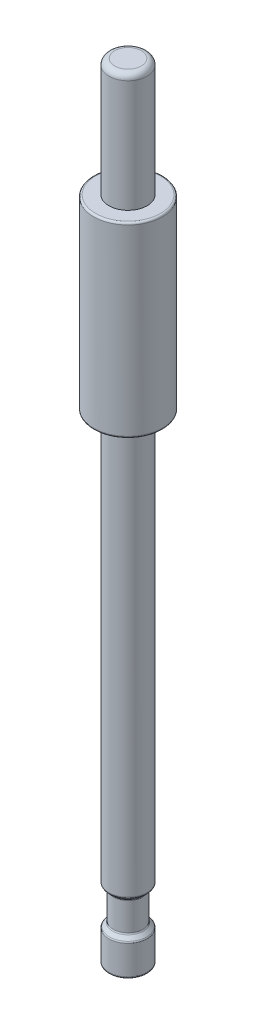
ISO-10303-21;
HEADER;
FILE_DESCRIPTION(('STEP AP214'),'2;1');
FILE_NAME('part.step','',(''),(''),'','','');
FILE_SCHEMA(('AUTOMOTIVE_DESIGN { 1 0 10303 214 1 1 1 1 }'));
ENDSEC;
DATA;
#1=APPLICATION_CONTEXT('core data for automotive mechanical design processes');
#2=APPLICATION_PROTOCOL_DEFINITION('international standard','automotive_design',2000,#1);
#3=PRODUCT_CONTEXT('',#1,'mechanical');
#4=PRODUCT('Part','Part','',(#3));
#5=PRODUCT_RELATED_PRODUCT_CATEGORY('part','',(#4));
#6=PRODUCT_DEFINITION_FORMATION('','',#4);
#7=PRODUCT_DEFINITION_CONTEXT('part definition',#1,'design');
#8=PRODUCT_DEFINITION('design','',#6,#7);
#9=PRODUCT_DEFINITION_SHAPE('','',#8);
#10=(LENGTH_UNIT() NAMED_UNIT(*) SI_UNIT(.MILLI.,.METRE.));
#11=(NAMED_UNIT(*) PLANE_ANGLE_UNIT() SI_UNIT($,.RADIAN.));
#12=(NAMED_UNIT(*) SI_UNIT($,.STERADIAN.) SOLID_ANGLE_UNIT());
#13=UNCERTAINTY_MEASURE_WITH_UNIT(LENGTH_MEASURE(1.E-05),#10,'distance_accuracy_value','');
#14=(GEOMETRIC_REPRESENTATION_CONTEXT(3) GLOBAL_UNCERTAINTY_ASSIGNED_CONTEXT((#13)) GLOBAL_UNIT_ASSIGNED_CONTEXT((#10,
#11,#12)) REPRESENTATION_CONTEXT('',''));
#15=CARTESIAN_POINT('',(0.,0.,0.));
#16=DIRECTION('',(0.,0.,1.));
#17=DIRECTION('',(1.,0.,0.));
#18=AXIS2_PLACEMENT_3D('',#15,#16,#17);
#19=CARTESIAN_POINT('',(0.,0.,0.));
#20=DIRECTION('',(0.,-1.,0.));
#21=DIRECTION('',(0.,0.,-1.));
#22=AXIS2_PLACEMENT_3D('',#19,#20,#21);
#23=PLANE('',#22);
#24=CARTESIAN_POINT('',(0.,0.,0.));
#25=DIRECTION('',(0.,-1.,0.));
#26=DIRECTION('',(0.,0.,-1.));
#27=AXIS2_PLACEMENT_3D('',#24,#25,#26);
#28=CIRCLE('',#27,0.675000000000002);
#29=CARTESIAN_POINT('',(0.,0.,-0.675000000000004));
#30=VERTEX_POINT('',#29);
#31=EDGE_CURVE('E11',#30,#30,#28,.F.);
#32=ORIENTED_EDGE('',*,*,#31,.T.);
#33=EDGE_LOOP('',(#32));
#34=FACE_BOUND('',#33,.T.);
#35=ADVANCED_FACE('F34',(#34),#23,.F.);
#36=CARTESIAN_POINT('',(0.,-45.7054064846005,0.));
#37=DIRECTION('',(0.,-1.,0.));
#38=DIRECTION('',(0.,0.,-1.));
#39=AXIS2_PLACEMENT_3D('',#36,#37,#38);
#40=CYLINDRICAL_SURFACE('',#39,0.975000000000002);
#41=CARTESIAN_POINT('',(0.,-0.300000000000002,0.));
#42=DIRECTION('',(0.,-1.,0.));
#43=DIRECTION('',(0.,0.,-1.));
#44=AXIS2_PLACEMENT_3D('',#41,#42,#43);
#45=CIRCLE('',#44,0.975000000000002);
#46=CARTESIAN_POINT('',(0.,-0.300000000000002,-0.975000000000004));
#47=VERTEX_POINT('',#46);
#48=EDGE_CURVE('E41',#47,#47,#45,.T.);
#49=ORIENTED_EDGE('',*,*,#48,.T.);
#50=EDGE_LOOP('',(#49));
#51=FACE_BOUND('',#50,.T.);
#52=CARTESIAN_POINT('',(0.,-6.,0.));
#53=DIRECTION('',(0.,-1.,0.));
#54=DIRECTION('',(0.,0.,-1.));
#55=AXIS2_PLACEMENT_3D('',#52,#53,#54);
#56=CIRCLE('',#55,0.975000000000002);
#57=CARTESIAN_POINT('',(0.,-6.,-0.975000000000004));
#58=VERTEX_POINT('',#57);
#59=EDGE_CURVE('E96',#58,#58,#56,.T.);
#60=ORIENTED_EDGE('',*,*,#59,.F.);
#61=EDGE_LOOP('',(#60));
#62=FACE_BOUND('',#61,.T.);
#63=ADVANCED_FACE('F121',(#51,#62),#40,.T.);
#64=CARTESIAN_POINT('',(0.,-6.,0.975));
#65=DIRECTION('',(0.,-1.,0.));
#66=DIRECTION('',(0.,0.,-1.));
#67=AXIS2_PLACEMENT_3D('',#64,#65,#66);
#68=PLANE('',#67);
#69=CARTESIAN_POINT('',(0.,-6.,0.));
#70=DIRECTION('',(0.,-1.,0.));
#71=DIRECTION('',(0.,0.,-1.));
#72=AXIS2_PLACEMENT_3D('',#69,#70,#71);
#73=CIRCLE('',#72,1.65);
#74=CARTESIAN_POINT('',(0.,-6.,-1.65));
#75=VERTEX_POINT('',#74);
#76=EDGE_CURVE('E49',#75,#75,#73,.F.);
#77=ORIENTED_EDGE('',*,*,#76,.T.);
#78=EDGE_LOOP('',(#77));
#79=FACE_BOUND('',#78,.T.);
#80=ORIENTED_EDGE('',*,*,#59,.T.);
#81=EDGE_LOOP('',(#80));
#82=FACE_BOUND('',#81,.T.);
#83=ADVANCED_FACE('F117',(#79,#82),#68,.F.);
#84=CARTESIAN_POINT('',(0.,-45.7054064846005,0.));
#85=DIRECTION('',(0.,-1.,0.));
#86=DIRECTION('',(0.,0.,-1.));
#87=AXIS2_PLACEMENT_3D('',#84,#85,#86);
#88=CYLINDRICAL_SURFACE('',#87,1.75);
#89=CARTESIAN_POINT('',(0.,-6.1,0.));
#90=DIRECTION('',(0.,-1.,0.));
#91=DIRECTION('',(0.,0.,-1.));
#92=AXIS2_PLACEMENT_3D('',#89,#90,#91);
#93=CIRCLE('',#92,1.75);
#94=CARTESIAN_POINT('',(0.,-6.1,-1.75));
#95=VERTEX_POINT('',#94);
#96=EDGE_CURVE('E54',#95,#95,#93,.T.);
#97=ORIENTED_EDGE('',*,*,#96,.T.);
#98=EDGE_LOOP('',(#97));
#99=FACE_BOUND('',#98,.T.);
#100=CARTESIAN_POINT('',(0.,-15.4,0.));
#101=DIRECTION('',(0.,1.,0.));
#102=DIRECTION('',(0.,0.,1.));
#103=AXIS2_PLACEMENT_3D('',#100,#101,#102);
#104=CIRCLE('',#103,1.75);
#105=CARTESIAN_POINT('',(0.,-15.4,1.75));
#106=VERTEX_POINT('',#105);
#107=EDGE_CURVE('E57',#106,#106,#104,.T.);
#108=ORIENTED_EDGE('',*,*,#107,.T.);
#109=EDGE_LOOP('',(#108));
#110=FACE_BOUND('',#109,.T.);
#111=ADVANCED_FACE('F107',(#99,#110),#88,.T.);
#112=CARTESIAN_POINT('',(0.,-15.5,1.75));
#113=DIRECTION('',(0.,1.,0.));
#114=DIRECTION('',(0.,0.,1.));
#115=AXIS2_PLACEMENT_3D('',#112,#113,#114);
#116=PLANE('',#115);
#117=CARTESIAN_POINT('',(0.,-15.5,0.));
#118=DIRECTION('',(0.,1.,0.));
#119=DIRECTION('',(0.,0.,1.));
#120=AXIS2_PLACEMENT_3D('',#117,#118,#119);
#121=CIRCLE('',#120,1.65);
#122=CARTESIAN_POINT('',(0.,-15.5,1.65));
#123=VERTEX_POINT('',#122);
#124=EDGE_CURVE('E45',#123,#123,#121,.F.);
#125=ORIENTED_EDGE('',*,*,#124,.T.);
#126=EDGE_LOOP('',(#125));
#127=FACE_BOUND('',#126,.T.);
#128=CARTESIAN_POINT('',(0.,-15.5,0.));
#129=DIRECTION('',(0.,-1.,0.));
#130=DIRECTION('',(0.,0.,-1.));
#131=AXIS2_PLACEMENT_3D('',#128,#129,#130);
#132=CIRCLE('',#131,0.975000000000002);
#133=CARTESIAN_POINT('',(0.,-15.5,-0.975000000000004));
#134=VERTEX_POINT('',#133);
#135=EDGE_CURVE('E99',#134,#134,#132,.T.);
#136=ORIENTED_EDGE('',*,*,#135,.F.);
#137=EDGE_LOOP('',(#136));
#138=FACE_BOUND('',#137,.T.);
#139=ADVANCED_FACE('F105',(#127,#138),#116,.F.);
#140=CARTESIAN_POINT('',(0.,-45.7054064846005,0.));
#141=DIRECTION('',(0.,-1.,0.));
#142=DIRECTION('',(0.,0.,-1.));
#143=AXIS2_PLACEMENT_3D('',#140,#141,#142);
#144=CYLINDRICAL_SURFACE('',#143,0.975);
#145=CARTESIAN_POINT('',(0.,-36.2335786437628,0.));
#146=DIRECTION('',(0.,1.,0.));
#147=DIRECTION('',(0.,0.,1.));
#148=AXIS2_PLACEMENT_3D('',#145,#146,#147);
#149=CIRCLE('',#148,0.975);
#150=CARTESIAN_POINT('',(0.,-36.2335786437628,0.974999999999999));
#151=VERTEX_POINT('',#150);
#152=EDGE_CURVE('E87',#151,#151,#149,.T.);
#153=ORIENTED_EDGE('',*,*,#152,.T.);
#154=EDGE_LOOP('',(#153));
#155=FACE_BOUND('',#154,.T.);
#156=ORIENTED_EDGE('',*,*,#135,.T.);
#157=EDGE_LOOP('',(#156));
#158=FACE_BOUND('',#157,.T.);
#159=ADVANCED_FACE('F103',(#155,#158),#144,.T.);
#160=CARTESIAN_POINT('',(0.,-36.2750000000001,0.));
#161=DIRECTION('',(0.,1.,0.));
#162=DIRECTION('',(0.,0.,1.));
#163=AXIS2_PLACEMENT_3D('',#160,#161,#162);
#164=CONICAL_SURFACE('',#163,0.974999999999999,0.785398163398021);
#165=CARTESIAN_POINT('',(0.,-36.3042893218815,0.));
#166=DIRECTION('',(0.,-1.,0.));
#167=DIRECTION('',(0.,0.,-1.));
#168=AXIS2_PLACEMENT_3D('',#165,#166,#167);
#169=CIRCLE('',#168,0.945710678118612);
#170=CARTESIAN_POINT('',(0.,-36.3042893218815,-0.945710678118614));
#171=VERTEX_POINT('',#170);
#172=EDGE_CURVE('E90',#171,#171,#169,.T.);
#173=ORIENTED_EDGE('',*,*,#172,.T.);
#174=EDGE_LOOP('',(#173));
#175=FACE_BOUND('',#174,.T.);
#176=CARTESIAN_POINT('',(0.,-36.4707106781185,0.));
#177=DIRECTION('',(0.,1.,0.));
#178=DIRECTION('',(0.,0.,1.));
#179=AXIS2_PLACEMENT_3D('',#176,#177,#178);
#180=CIRCLE('',#179,0.779289321881382);
#181=CARTESIAN_POINT('',(0.,-36.4707106781185,0.77928932188138));
#182=VERTEX_POINT('',#181);
#183=EDGE_CURVE('E93',#182,#182,#180,.T.);
#184=ORIENTED_EDGE('',*,*,#183,.T.);
#185=EDGE_LOOP('',(#184));
#186=FACE_BOUND('',#185,.T.);
#187=ADVANCED_FACE('F114',(#175,#186),#164,.T.);
#188=CARTESIAN_POINT('',(0.,-45.7054064846005,0.));
#189=DIRECTION('',(0.,-1.,0.));
#190=DIRECTION('',(0.,0.,-1.));
#191=AXIS2_PLACEMENT_3D('',#188,#189,#190);
#192=CYLINDRICAL_SURFACE('',#191,0.750000000000002);
#193=CARTESIAN_POINT('',(0.,-36.5414213562372,0.));
#194=DIRECTION('',(0.,-1.,0.));
#195=DIRECTION('',(0.,0.,-1.));
#196=AXIS2_PLACEMENT_3D('',#193,#194,#195);
#197=CIRCLE('',#196,0.750000000000002);
#198=CARTESIAN_POINT('',(0.,-36.5414213562372,-0.750000000000003));
#199=VERTEX_POINT('',#198);
#200=EDGE_CURVE('E81',#199,#199,#197,.T.);
#201=ORIENTED_EDGE('',*,*,#200,.T.);
#202=EDGE_LOOP('',(#201));
#203=FACE_BOUND('',#202,.T.);
#204=CARTESIAN_POINT('',(0.,-37.9585786437626,0.));
#205=DIRECTION('',(0.,-1.,0.));
#206=DIRECTION('',(0.,0.,-1.));
#207=AXIS2_PLACEMENT_3D('',#204,#205,#206);
#208=CIRCLE('',#207,0.750000000000002);
#209=CARTESIAN_POINT('',(0.,-37.9585786437626,-0.750000000000003));
#210=VERTEX_POINT('',#209);
#211=EDGE_CURVE('E84',#210,#210,#208,.F.);
#212=ORIENTED_EDGE('',*,*,#211,.T.);
#213=EDGE_LOOP('',(#212));
#214=FACE_BOUND('',#213,.T.);
#215=ADVANCED_FACE('F261',(#203,#214),#192,.T.);
#216=CARTESIAN_POINT('',(0.,-37.9999999999999,0.));
#217=DIRECTION('',(0.,-1.,0.));
#218=DIRECTION('',(0.,0.,-1.));
#219=AXIS2_PLACEMENT_3D('',#216,#217,#218);
#220=CONICAL_SURFACE('',#219,0.750000000000002,0.78539816339688);
#221=CARTESIAN_POINT('',(0.,-38.0292893218812,0.));
#222=DIRECTION('',(0.,-1.,0.));
#223=DIRECTION('',(0.,0.,-1.));
#224=AXIS2_PLACEMENT_3D('',#221,#222,#223);
#225=CIRCLE('',#224,0.779289321881309);
#226=CARTESIAN_POINT('',(0.,-38.0292893218812,-0.779289321881311));
#227=VERTEX_POINT('',#226);
#228=EDGE_CURVE('E75',#227,#227,#225,.T.);
#229=ORIENTED_EDGE('',*,*,#228,.T.);
#230=EDGE_LOOP('',(#229));
#231=FACE_BOUND('',#230,.T.);
#232=CARTESIAN_POINT('',(0.,-38.1957106781188,0.));
#233=DIRECTION('',(0.,1.,0.));
#234=DIRECTION('',(0.,0.,1.));
#235=AXIS2_PLACEMENT_3D('',#232,#233,#234);
#236=CIRCLE('',#235,0.945710678118692);
#237=CARTESIAN_POINT('',(0.,-38.1957106781188,0.94571067811869));
#238=VERTEX_POINT('',#237);
#239=EDGE_CURVE('E78',#238,#238,#236,.T.);
#240=ORIENTED_EDGE('',*,*,#239,.T.);
#241=EDGE_LOOP('',(#240));
#242=FACE_BOUND('',#241,.T.);
#243=ADVANCED_FACE('F251',(#231,#242),#220,.T.);
#244=CARTESIAN_POINT('',(0.,-45.7054064846005,0.));
#245=DIRECTION('',(0.,-1.,0.));
#246=DIRECTION('',(0.,0.,-1.));
#247=AXIS2_PLACEMENT_3D('',#244,#245,#246);
#248=CYLINDRICAL_SURFACE('',#247,0.974999999999999);
#249=CARTESIAN_POINT('',(0.,-38.2664213562374,0.));
#250=DIRECTION('',(0.,1.,0.));
#251=DIRECTION('',(0.,0.,1.));
#252=AXIS2_PLACEMENT_3D('',#249,#250,#251);
#253=CIRCLE('',#252,0.974999999999999);
#254=CARTESIAN_POINT('',(0.,-38.2664213562374,0.974999999999997));
#255=VERTEX_POINT('',#254);
#256=EDGE_CURVE('E69',#255,#255,#253,.F.);
#257=ORIENTED_EDGE('',*,*,#256,.T.);
#258=EDGE_LOOP('',(#257));
#259=FACE_BOUND('',#258,.T.);
#260=CARTESIAN_POINT('',(0.,-39.7378810334819,0.));
#261=DIRECTION('',(0.,1.,0.));
#262=DIRECTION('',(0.,0.,1.));
#263=AXIS2_PLACEMENT_3D('',#260,#261,#262);
#264=CIRCLE('',#263,0.974999999999999);
#265=CARTESIAN_POINT('',(0.,-39.7378810334819,0.974999999999997));
#266=VERTEX_POINT('',#265);
#267=EDGE_CURVE('E72',#266,#266,#264,.T.);
#268=ORIENTED_EDGE('',*,*,#267,.T.);
#269=EDGE_LOOP('',(#268));
#270=FACE_BOUND('',#269,.T.);
#271=ADVANCED_FACE('F241',(#259,#270),#248,.T.);
#272=CARTESIAN_POINT('',(0.,-39.7899377385371,0.));
#273=DIRECTION('',(0.,1.,0.));
#274=DIRECTION('',(0.,0.,1.));
#275=AXIS2_PLACEMENT_3D('',#272,#273,#274);
#276=CONICAL_SURFACE('',#275,0.974999999999999,0.95993108859688);
#277=CARTESIAN_POINT('',(0.,-39.8197962379108,0.));
#278=DIRECTION('',(0.,-1.,0.));
#279=DIRECTION('',(0.,0.,-1.));
#280=AXIS2_PLACEMENT_3D('',#277,#278,#279);
#281=CIRCLE('',#280,0.932357643635105);
#282=CARTESIAN_POINT('',(0.,-39.8197962379108,-0.932357643635106));
#283=VERTEX_POINT('',#282);
#284=EDGE_CURVE('E63',#283,#283,#281,.T.);
#285=ORIENTED_EDGE('',*,*,#284,.T.);
#286=EDGE_LOOP('',(#285));
#287=FACE_BOUND('',#286,.T.);
#288=CARTESIAN_POINT('',(0.,-39.9819152044289,0.));
#289=DIRECTION('',(0.,-1.,0.));
#290=DIRECTION('',(0.,0.,-1.));
#291=AXIS2_PLACEMENT_3D('',#288,#289,#290);
#292=CIRCLE('',#291,0.700827764747213);
#293=CARTESIAN_POINT('',(0.,-39.9819152044289,-0.700827764747215));
#294=VERTEX_POINT('',#293);
#295=EDGE_CURVE('E66',#294,#294,#292,.F.);
#296=ORIENTED_EDGE('',*,*,#295,.T.);
#297=EDGE_LOOP('',(#296));
#298=FACE_BOUND('',#297,.T.);
#299=ADVANCED_FACE('F231',(#287,#298),#276,.T.);
#300=CARTESIAN_POINT('',(0.,-40.,0.675000000000001));
#301=DIRECTION('',(0.,1.,0.));
#302=DIRECTION('',(0.,0.,1.));
#303=AXIS2_PLACEMENT_3D('',#300,#301,#302);
#304=PLANE('',#303);
#305=CARTESIAN_POINT('',(0.,-40.,0.));
#306=DIRECTION('',(0.,1.,0.));
#307=DIRECTION('',(0.,0.,1.));
#308=AXIS2_PLACEMENT_3D('',#305,#306,#307);
#309=CIRCLE('',#308,0.643470121112108);
#310=CARTESIAN_POINT('',(0.,-40.,0.643470121112106));
#311=VERTEX_POINT('',#310);
#312=EDGE_CURVE('E60',#311,#311,#309,.F.);
#313=ORIENTED_EDGE('',*,*,#312,.T.);
#314=EDGE_LOOP('',(#313));
#315=FACE_BOUND('',#314,.T.);
#316=ADVANCED_FACE('F133',(#315),#304,.F.);
#317=CARTESIAN_POINT('',(0.,-36.2335786437628,0.));
#318=DIRECTION('',(0.,1.,0.));
#319=DIRECTION('',(0.,0.,1.));
#320=AXIS2_PLACEMENT_3D('',#317,#318,#319);
#321=TOROIDAL_SURFACE('',#320,0.875,0.1);
#322=ORIENTED_EDGE('',*,*,#152,.F.);
#323=EDGE_LOOP('',(#322));
#324=FACE_BOUND('',#323,.T.);
#325=ORIENTED_EDGE('',*,*,#172,.F.);
#326=EDGE_LOOP('',(#325));
#327=FACE_BOUND('',#326,.T.);
#328=ADVANCED_FACE('F129',(#324,#327),#321,.T.);
#329=CARTESIAN_POINT('',(0.,-36.5414213562372,0.));
#330=DIRECTION('',(0.,-1.,0.));
#331=DIRECTION('',(0.,0.,-1.));
#332=AXIS2_PLACEMENT_3D('',#329,#330,#331);
#333=TOROIDAL_SURFACE('',#332,0.850000000000002,0.1);
#334=ORIENTED_EDGE('',*,*,#183,.F.);
#335=EDGE_LOOP('',(#334));
#336=FACE_BOUND('',#335,.T.);
#337=ORIENTED_EDGE('',*,*,#200,.F.);
#338=EDGE_LOOP('',(#337));
#339=FACE_BOUND('',#338,.T.);
#340=ADVANCED_FACE('F132',(#336,#339),#333,.F.);
#341=CARTESIAN_POINT('',(0.,-37.9585786437626,0.));
#342=DIRECTION('',(0.,-1.,0.));
#343=DIRECTION('',(0.,0.,-1.));
#344=AXIS2_PLACEMENT_3D('',#341,#342,#343);
#345=TOROIDAL_SURFACE('',#344,0.850000000000002,0.1);
#346=ORIENTED_EDGE('',*,*,#211,.F.);
#347=EDGE_LOOP('',(#346));
#348=FACE_BOUND('',#347,.T.);
#349=ORIENTED_EDGE('',*,*,#228,.F.);
#350=EDGE_LOOP('',(#349));
#351=FACE_BOUND('',#350,.T.);
#352=ADVANCED_FACE('F137',(#348,#351),#345,.F.);
#353=CARTESIAN_POINT('',(0.,-38.2664213562374,0.));
#354=DIRECTION('',(0.,1.,0.));
#355=DIRECTION('',(0.,0.,1.));
#356=AXIS2_PLACEMENT_3D('',#353,#354,#355);
#357=TOROIDAL_SURFACE('',#356,0.874999999999999,0.1);
#358=ORIENTED_EDGE('',*,*,#239,.F.);
#359=EDGE_LOOP('',(#358));
#360=FACE_BOUND('',#359,.T.);
#361=ORIENTED_EDGE('',*,*,#256,.F.);
#362=EDGE_LOOP('',(#361));
#363=FACE_BOUND('',#362,.T.);
#364=ADVANCED_FACE('F141',(#360,#363),#357,.T.);
#365=CARTESIAN_POINT('',(0.,-39.7378810334819,0.));
#366=DIRECTION('',(0.,1.,0.));
#367=DIRECTION('',(0.,0.,1.));
#368=AXIS2_PLACEMENT_3D('',#365,#366,#367);
#369=TOROIDAL_SURFACE('',#368,0.874999999999999,0.1);
#370=ORIENTED_EDGE('',*,*,#267,.F.);
#371=EDGE_LOOP('',(#370));
#372=FACE_BOUND('',#371,.T.);
#373=ORIENTED_EDGE('',*,*,#284,.F.);
#374=EDGE_LOOP('',(#373));
#375=FACE_BOUND('',#374,.T.);
#376=ADVANCED_FACE('F145',(#372,#375),#369,.T.);
#377=CARTESIAN_POINT('',(0.,-39.9,0.));
#378=DIRECTION('',(0.,1.,0.));
#379=DIRECTION('',(0.,0.,1.));
#380=AXIS2_PLACEMENT_3D('',#377,#378,#379);
#381=TOROIDAL_SURFACE('',#380,0.643470121112108,0.1);
#382=ORIENTED_EDGE('',*,*,#295,.F.);
#383=EDGE_LOOP('',(#382));
#384=FACE_BOUND('',#383,.T.);
#385=ORIENTED_EDGE('',*,*,#312,.F.);
#386=EDGE_LOOP('',(#385));
#387=FACE_BOUND('',#386,.T.);
#388=ADVANCED_FACE('F149',(#384,#387),#381,.T.);
#389=CARTESIAN_POINT('',(0.,-6.1,0.));
#390=DIRECTION('',(0.,-1.,0.));
#391=DIRECTION('',(0.,0.,-1.));
#392=AXIS2_PLACEMENT_3D('',#389,#390,#391);
#393=TOROIDAL_SURFACE('',#392,1.65,0.1);
#394=ORIENTED_EDGE('',*,*,#76,.F.);
#395=EDGE_LOOP('',(#394));
#396=FACE_BOUND('',#395,.T.);
#397=ORIENTED_EDGE('',*,*,#96,.F.);
#398=EDGE_LOOP('',(#397));
#399=FACE_BOUND('',#398,.T.);
#400=ADVANCED_FACE('F153',(#396,#399),#393,.T.);
#401=CARTESIAN_POINT('',(0.,-15.4,0.));
#402=DIRECTION('',(0.,1.,0.));
#403=DIRECTION('',(0.,0.,1.));
#404=AXIS2_PLACEMENT_3D('',#401,#402,#403);
#405=TOROIDAL_SURFACE('',#404,1.65,0.1);
#406=ORIENTED_EDGE('',*,*,#107,.F.);
#407=EDGE_LOOP('',(#406));
#408=FACE_BOUND('',#407,.T.);
#409=ORIENTED_EDGE('',*,*,#124,.F.);
#410=EDGE_LOOP('',(#409));
#411=FACE_BOUND('',#410,.T.);
#412=ADVANCED_FACE('F156',(#408,#411),#405,.T.);
#413=CARTESIAN_POINT('',(0.,-0.300000000000002,0.));
#414=DIRECTION('',(0.,-1.,0.));
#415=DIRECTION('',(0.,0.,-1.));
#416=AXIS2_PLACEMENT_3D('',#413,#414,#415);
#417=TOROIDAL_SURFACE('',#416,0.675000000000002,0.3);
#418=ORIENTED_EDGE('',*,*,#31,.F.);
#419=EDGE_LOOP('',(#418));
#420=FACE_BOUND('',#419,.T.);
#421=ORIENTED_EDGE('',*,*,#48,.F.);
#422=EDGE_LOOP('',(#421));
#423=FACE_BOUND('',#422,.T.);
#424=ADVANCED_FACE('F36',(#420,#423),#417,.T.);
#425=CLOSED_SHELL('',(#35,#63,#83,#111,#139,#159,#187,#215,#243,#271,#299,#316,#328,#340,#352,
#364,#376,#388,#400,#412,#424));
#426=MANIFOLD_SOLID_BREP('B2',#425);
#427=ADVANCED_BREP_SHAPE_REPRESENTATION('',(#18,#426),#14);
#428=SHAPE_DEFINITION_REPRESENTATION(#9,#427);
ENDSEC;
END-ISO-10303-21;
